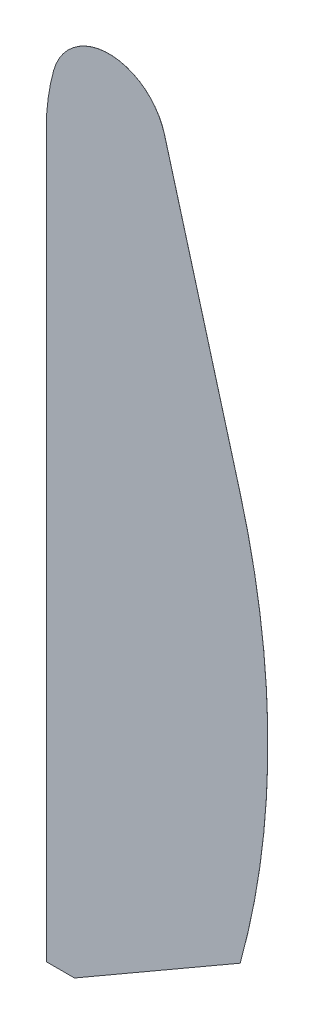
ISO-10303-21;
HEADER;
FILE_DESCRIPTION(('STEP AP214'),'2;1');
FILE_NAME('part.step','',(''),(''),'','','');
FILE_SCHEMA(('AUTOMOTIVE_DESIGN { 1 0 10303 214 1 1 1 1 }'));
ENDSEC;
DATA;
#1=APPLICATION_CONTEXT('core data for automotive mechanical design processes');
#2=APPLICATION_PROTOCOL_DEFINITION('international standard','automotive_design',2000,#1);
#3=PRODUCT_CONTEXT('',#1,'mechanical');
#4=PRODUCT('Part','Part','',(#3));
#5=PRODUCT_RELATED_PRODUCT_CATEGORY('part','',(#4));
#6=PRODUCT_DEFINITION_FORMATION('','',#4);
#7=PRODUCT_DEFINITION_CONTEXT('part definition',#1,'design');
#8=PRODUCT_DEFINITION('design','',#6,#7);
#9=PRODUCT_DEFINITION_SHAPE('','',#8);
#10=(LENGTH_UNIT() NAMED_UNIT(*) SI_UNIT(.MILLI.,.METRE.));
#11=(NAMED_UNIT(*) PLANE_ANGLE_UNIT() SI_UNIT($,.RADIAN.));
#12=(NAMED_UNIT(*) SI_UNIT($,.STERADIAN.) SOLID_ANGLE_UNIT());
#13=UNCERTAINTY_MEASURE_WITH_UNIT(LENGTH_MEASURE(1.E-05),#10,'distance_accuracy_value','');
#14=(GEOMETRIC_REPRESENTATION_CONTEXT(3) GLOBAL_UNCERTAINTY_ASSIGNED_CONTEXT((#13)) GLOBAL_UNIT_ASSIGNED_CONTEXT((#10,
#11,#12)) REPRESENTATION_CONTEXT('',''));
#15=CARTESIAN_POINT('',(0.,0.,0.));
#16=DIRECTION('',(0.,0.,1.));
#17=DIRECTION('',(1.,0.,0.));
#18=AXIS2_PLACEMENT_3D('',#15,#16,#17);
#19=CARTESIAN_POINT('',(11.1315931363908,134.775716725057,0.01));
#20=DIRECTION('',(0.,0.,-1.));
#21=DIRECTION('',(-1.,0.,0.));
#22=AXIS2_PLACEMENT_3D('',#19,#20,#21);
#23=CYLINDRICAL_SURFACE('',#22,10.1922607181031);
#24=CARTESIAN_POINT('',(11.1315931363908,134.775716725057,0.));
#25=DIRECTION('',(0.,0.,-1.));
#26=DIRECTION('',(-1.,0.,0.));
#27=AXIS2_PLACEMENT_3D('',#24,#25,#26);
#28=CIRCLE('',#27,10.1922607181031);
#29=CARTESIAN_POINT('',(1.3101645649633,137.5,0.));
#30=VERTEX_POINT('',#29);
#31=CARTESIAN_POINT('',(20.9530217078183,137.5,0.));
#32=VERTEX_POINT('',#31);
#33=EDGE_CURVE('E129',#30,#32,#28,.T.);
#34=ORIENTED_EDGE('',*,*,#33,.F.);
#35=DIRECTION('',(0.,0.,-1.));
#36=VECTOR('',#35,1.);
#37=CARTESIAN_POINT('',(1.3101645649633,137.5,0.01));
#38=LINE('',#37,#36);
#39=CARTESIAN_POINT('',(1.3101645649633,137.5,0.01));
#40=VERTEX_POINT('',#39);
#41=EDGE_CURVE('E11',#40,#30,#38,.T.);
#42=ORIENTED_EDGE('',*,*,#41,.F.);
#43=CARTESIAN_POINT('',(11.1315931363908,134.775716725057,0.01));
#44=DIRECTION('',(0.,0.,-1.));
#45=DIRECTION('',(-1.,0.,0.));
#46=AXIS2_PLACEMENT_3D('',#43,#44,#45);
#47=CIRCLE('',#46,10.1922607181031);
#48=CARTESIAN_POINT('',(20.9530217078183,137.5,0.01));
#49=VERTEX_POINT('',#48);
#50=EDGE_CURVE('E144',#40,#49,#47,.T.);
#51=ORIENTED_EDGE('',*,*,#50,.T.);
#52=DIRECTION('',(0.,0.,-1.));
#53=VECTOR('',#52,1.);
#54=CARTESIAN_POINT('',(20.9530217078183,137.5,0.01));
#55=LINE('',#54,#53);
#56=EDGE_CURVE('E42',#49,#32,#55,.T.);
#57=ORIENTED_EDGE('',*,*,#56,.T.);
#58=EDGE_LOOP('',(#34,#42,#51,#57));
#59=FACE_BOUND('',#58,.T.);
#60=ADVANCED_FACE('F41',(#59),#23,.T.);
#61=CARTESIAN_POINT('',(36.0096581416584,127.875,0.01));
#62=DIRECTION('',(0.,0.,-1.));
#63=DIRECTION('',(-1.,0.,0.));
#64=AXIS2_PLACEMENT_3D('',#61,#62,#63);
#65=CYLINDRICAL_SURFACE('',#64,36.0096581416584);
#66=CARTESIAN_POINT('',(36.0096581416584,127.875,0.));
#67=DIRECTION('',(0.,0.,-1.));
#68=DIRECTION('',(-1.,0.,0.));
#69=AXIS2_PLACEMENT_3D('',#66,#67,#68);
#70=CIRCLE('',#69,36.0096581416584);
#71=CARTESIAN_POINT('',(0.,127.875,0.));
#72=VERTEX_POINT('',#71);
#73=EDGE_CURVE('E141',#72,#30,#70,.T.);
#74=ORIENTED_EDGE('',*,*,#73,.F.);
#75=DIRECTION('',(0.,0.,-1.));
#76=VECTOR('',#75,1.);
#77=CARTESIAN_POINT('',(0.,127.875,0.01));
#78=LINE('',#77,#76);
#79=CARTESIAN_POINT('',(0.,127.875,0.01));
#80=VERTEX_POINT('',#79);
#81=EDGE_CURVE('E49',#80,#72,#78,.T.);
#82=ORIENTED_EDGE('',*,*,#81,.F.);
#83=CARTESIAN_POINT('',(36.0096581416584,127.875,0.01));
#84=DIRECTION('',(0.,0.,-1.));
#85=DIRECTION('',(-1.,0.,0.));
#86=AXIS2_PLACEMENT_3D('',#83,#84,#85);
#87=CIRCLE('',#86,36.0096581416584);
#88=EDGE_CURVE('E121',#80,#40,#87,.T.);
#89=ORIENTED_EDGE('',*,*,#88,.T.);
#90=ORIENTED_EDGE('',*,*,#41,.T.);
#91=EDGE_LOOP('',(#74,#82,#89,#90));
#92=FACE_BOUND('',#91,.T.);
#93=ADVANCED_FACE('F160',(#92),#65,.T.);
#94=CARTESIAN_POINT('',(0.,0.,0.01));
#95=DIRECTION('',(-1.,0.,0.));
#96=DIRECTION('',(0.,0.,1.));
#97=AXIS2_PLACEMENT_3D('',#94,#95,#96);
#98=PLANE('',#97);
#99=DIRECTION('',(0.,1.,0.));
#100=VECTOR('',#99,1.);
#101=CARTESIAN_POINT('',(0.,0.,0.));
#102=LINE('',#101,#100);
#103=CARTESIAN_POINT('',(0.,0.,0.));
#104=VERTEX_POINT('',#103);
#105=EDGE_CURVE('E109',#104,#72,#102,.T.);
#106=ORIENTED_EDGE('',*,*,#105,.F.);
#107=DIRECTION('',(0.,0.,-1.));
#108=VECTOR('',#107,1.);
#109=CARTESIAN_POINT('',(0.,0.,0.01));
#110=LINE('',#109,#108);
#111=CARTESIAN_POINT('',(0.,0.,0.01));
#112=VERTEX_POINT('',#111);
#113=EDGE_CURVE('E102',#112,#104,#110,.T.);
#114=ORIENTED_EDGE('',*,*,#113,.F.);
#115=DIRECTION('',(0.,1.,0.));
#116=VECTOR('',#115,1.);
#117=CARTESIAN_POINT('',(0.,0.,0.01));
#118=LINE('',#117,#116);
#119=EDGE_CURVE('E107',#112,#80,#118,.T.);
#120=ORIENTED_EDGE('',*,*,#119,.T.);
#121=ORIENTED_EDGE('',*,*,#81,.T.);
#122=EDGE_LOOP('',(#106,#114,#120,#121));
#123=FACE_BOUND('',#122,.T.);
#124=ADVANCED_FACE('F106',(#123),#98,.T.);
#125=CARTESIAN_POINT('',(0.,0.,0.01));
#126=DIRECTION('',(0.,1.,0.));
#127=DIRECTION('',(-1.,0.,0.));
#128=AXIS2_PLACEMENT_3D('',#125,#126,#127);
#129=PLANE('',#128);
#130=DIRECTION('',(1.,0.,0.));
#131=VECTOR('',#130,1.);
#132=CARTESIAN_POINT('',(0.,0.,0.));
#133=LINE('',#132,#131);
#134=CARTESIAN_POINT('',(5.,0.,0.));
#135=VERTEX_POINT('',#134);
#136=EDGE_CURVE('E138',#104,#135,#133,.T.);
#137=ORIENTED_EDGE('',*,*,#136,.T.);
#138=DIRECTION('',(0.,0.,-1.));
#139=VECTOR('',#138,1.);
#140=CARTESIAN_POINT('',(5.,0.,0.01));
#141=LINE('',#140,#139);
#142=CARTESIAN_POINT('',(5.,0.,0.01));
#143=VERTEX_POINT('',#142);
#144=EDGE_CURVE('E114',#143,#135,#141,.T.);
#145=ORIENTED_EDGE('',*,*,#144,.F.);
#146=DIRECTION('',(1.,0.,0.));
#147=VECTOR('',#146,1.);
#148=CARTESIAN_POINT('',(0.,0.,0.01));
#149=LINE('',#148,#147);
#150=EDGE_CURVE('E116',#112,#143,#149,.T.);
#151=ORIENTED_EDGE('',*,*,#150,.F.);
#152=ORIENTED_EDGE('',*,*,#113,.T.);
#153=EDGE_LOOP('',(#137,#145,#151,#152));
#154=FACE_BOUND('',#153,.T.);
#155=ADVANCED_FACE('F120',(#154),#129,.F.);
#156=CARTESIAN_POINT('',(5.,0.,0.01));
#157=DIRECTION('',(-0.500000000000001,0.866025403784438,0.));
#158=DIRECTION('',(-0.866025403784438,-0.500000000000001,0.));
#159=AXIS2_PLACEMENT_3D('',#156,#157,#158);
#160=PLANE('',#159);
#161=DIRECTION('',(0.866025403784438,0.500000000000001,0.));
#162=VECTOR('',#161,1.);
#163=CARTESIAN_POINT('',(5.,0.,0.));
#164=LINE('',#163,#162);
#165=CARTESIAN_POINT('',(34.3749999999962,16.9596641574431,0.));
#166=VERTEX_POINT('',#165);
#167=EDGE_CURVE('E139',#135,#166,#164,.T.);
#168=ORIENTED_EDGE('',*,*,#167,.T.);
#169=DIRECTION('',(0.,0.,-1.));
#170=VECTOR('',#169,1.);
#171=CARTESIAN_POINT('',(34.3749999999962,16.9596641574431,0.01));
#172=LINE('',#171,#170);
#173=CARTESIAN_POINT('',(34.3749999999962,16.9596641574431,0.01));
#174=VERTEX_POINT('',#173);
#175=EDGE_CURVE('E149',#174,#166,#172,.T.);
#176=ORIENTED_EDGE('',*,*,#175,.F.);
#177=DIRECTION('',(0.866025403784438,0.500000000000001,0.));
#178=VECTOR('',#177,1.);
#179=CARTESIAN_POINT('',(5.,0.,0.01));
#180=LINE('',#179,#178);
#181=EDGE_CURVE('E122',#143,#174,#180,.T.);
#182=ORIENTED_EDGE('',*,*,#181,.F.);
#183=ORIENTED_EDGE('',*,*,#144,.T.);
#184=EDGE_LOOP('',(#168,#176,#182,#183));
#185=FACE_BOUND('',#184,.T.);
#186=ADVANCED_FACE('F168',(#185),#160,.F.);
#187=CARTESIAN_POINT('',(-95.6844622775772,53.035761972957,0.01));
#188=DIRECTION('',(0.,0.,-1.));
#189=DIRECTION('',(-1.,0.,0.));
#190=AXIS2_PLACEMENT_3D('',#187,#188,#189);
#191=CYLINDRICAL_SURFACE('',#190,134.970176563291);
#192=CARTESIAN_POINT('',(-95.6844622775772,53.035761972957,0.));
#193=DIRECTION('',(0.,0.,1.));
#194=DIRECTION('',(1.,0.,0.));
#195=AXIS2_PLACEMENT_3D('',#192,#193,#194);
#196=CIRCLE('',#195,134.970176563291);
#197=CARTESIAN_POINT('',(34.3749999999962,89.1118597884708,0.));
#198=VERTEX_POINT('',#197);
#199=EDGE_CURVE('E134',#166,#198,#196,.T.);
#200=ORIENTED_EDGE('',*,*,#199,.T.);
#201=DIRECTION('',(0.,0.,-1.));
#202=VECTOR('',#201,1.);
#203=CARTESIAN_POINT('',(34.3749999999962,89.1118597884708,0.01));
#204=LINE('',#203,#202);
#205=CARTESIAN_POINT('',(34.3749999999962,89.1118597884708,0.01));
#206=VERTEX_POINT('',#205);
#207=EDGE_CURVE('E151',#206,#198,#204,.T.);
#208=ORIENTED_EDGE('',*,*,#207,.F.);
#209=CARTESIAN_POINT('',(-95.6844622775772,53.035761972957,0.01));
#210=DIRECTION('',(0.,0.,1.));
#211=DIRECTION('',(1.,0.,0.));
#212=AXIS2_PLACEMENT_3D('',#209,#210,#211);
#213=CIRCLE('',#212,134.970176563291);
#214=EDGE_CURVE('E233',#174,#206,#213,.T.);
#215=ORIENTED_EDGE('',*,*,#214,.F.);
#216=ORIENTED_EDGE('',*,*,#175,.T.);
#217=EDGE_LOOP('',(#200,#208,#215,#216));
#218=FACE_BOUND('',#217,.T.);
#219=ADVANCED_FACE('F172',(#218),#191,.T.);
#220=CARTESIAN_POINT('',(20.9530217078183,137.5,0.01));
#221=DIRECTION('',(0.963616300943229,0.26728940225248,0.));
#222=DIRECTION('',(-0.26728940225248,0.963616300943229,0.));
#223=AXIS2_PLACEMENT_3D('',#220,#221,#222);
#224=PLANE('',#223);
#225=DIRECTION('',(0.26728940225248,-0.963616300943229,0.));
#226=VECTOR('',#225,1.);
#227=CARTESIAN_POINT('',(20.9530217078183,137.5,0.));
#228=LINE('',#227,#226);
#229=EDGE_CURVE('E135',#32,#198,#228,.T.);
#230=ORIENTED_EDGE('',*,*,#229,.F.);
#231=ORIENTED_EDGE('',*,*,#56,.F.);
#232=DIRECTION('',(0.26728940225248,-0.963616300943229,0.));
#233=VECTOR('',#232,1.);
#234=CARTESIAN_POINT('',(20.9530217078183,137.5,0.01));
#235=LINE('',#234,#233);
#236=EDGE_CURVE('E237',#49,#206,#235,.T.);
#237=ORIENTED_EDGE('',*,*,#236,.T.);
#238=ORIENTED_EDGE('',*,*,#207,.T.);
#239=EDGE_LOOP('',(#230,#231,#237,#238));
#240=FACE_BOUND('',#239,.T.);
#241=ADVANCED_FACE('F153',(#240),#224,.T.);
#242=CARTESIAN_POINT('',(11.1315931363908,134.775716725057,0.01));
#243=DIRECTION('',(0.,0.,-1.));
#244=DIRECTION('',(-1.,0.,0.));
#245=AXIS2_PLACEMENT_3D('',#242,#243,#244);
#246=PLANE('',#245);
#247=ORIENTED_EDGE('',*,*,#50,.F.);
#248=ORIENTED_EDGE('',*,*,#88,.F.);
#249=ORIENTED_EDGE('',*,*,#119,.F.);
#250=ORIENTED_EDGE('',*,*,#150,.T.);
#251=ORIENTED_EDGE('',*,*,#181,.T.);
#252=ORIENTED_EDGE('',*,*,#214,.T.);
#253=ORIENTED_EDGE('',*,*,#236,.F.);
#254=EDGE_LOOP('',(#247,#248,#249,#250,#251,#252,#253));
#255=FACE_BOUND('',#254,.T.);
#256=ADVANCED_FACE('F124',(#255),#246,.F.);
#257=CARTESIAN_POINT('',(11.1315931363908,134.775716725057,0.));
#258=DIRECTION('',(0.,0.,-1.));
#259=DIRECTION('',(-1.,0.,0.));
#260=AXIS2_PLACEMENT_3D('',#257,#258,#259);
#261=PLANE('',#260);
#262=ORIENTED_EDGE('',*,*,#33,.T.);
#263=ORIENTED_EDGE('',*,*,#229,.T.);
#264=ORIENTED_EDGE('',*,*,#199,.F.);
#265=ORIENTED_EDGE('',*,*,#167,.F.);
#266=ORIENTED_EDGE('',*,*,#136,.F.);
#267=ORIENTED_EDGE('',*,*,#105,.T.);
#268=ORIENTED_EDGE('',*,*,#73,.T.);
#269=EDGE_LOOP('',(#262,#263,#264,#265,#266,#267,#268));
#270=FACE_BOUND('',#269,.T.);
#271=ADVANCED_FACE('F156',(#270),#261,.T.);
#272=CLOSED_SHELL('',(#60,#93,#124,#155,#186,#219,#241,#256,#271));
#273=MANIFOLD_SOLID_BREP('B2',#272);
#274=ADVANCED_BREP_SHAPE_REPRESENTATION('',(#18,#273),#14);
#275=SHAPE_DEFINITION_REPRESENTATION(#9,#274);
ENDSEC;
END-ISO-10303-21;
